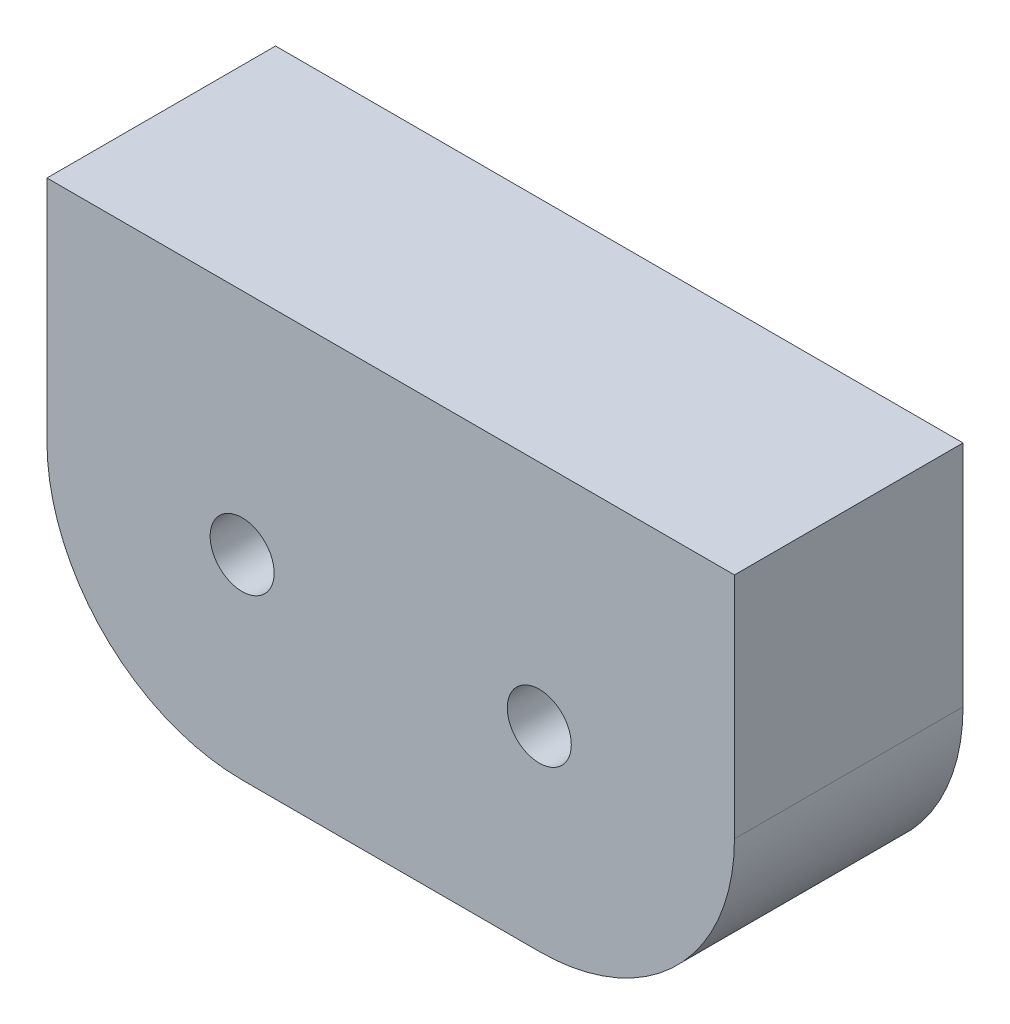
ISO-10303-21;
HEADER;
FILE_DESCRIPTION(('STEP AP214'),'2;1');
FILE_NAME('part.step','',(''),(''),'','','');
FILE_SCHEMA(('AUTOMOTIVE_DESIGN { 1 0 10303 214 1 1 1 1 }'));
ENDSEC;
DATA;
#1=APPLICATION_CONTEXT('core data for automotive mechanical design processes');
#2=APPLICATION_PROTOCOL_DEFINITION('international standard','automotive_design',2000,#1);
#3=PRODUCT_CONTEXT('',#1,'mechanical');
#4=PRODUCT('Part','Part','',(#3));
#5=PRODUCT_RELATED_PRODUCT_CATEGORY('part','',(#4));
#6=PRODUCT_DEFINITION_FORMATION('','',#4);
#7=PRODUCT_DEFINITION_CONTEXT('part definition',#1,'design');
#8=PRODUCT_DEFINITION('design','',#6,#7);
#9=PRODUCT_DEFINITION_SHAPE('','',#8);
#10=(LENGTH_UNIT() NAMED_UNIT(*) SI_UNIT(.MILLI.,.METRE.));
#11=(NAMED_UNIT(*) PLANE_ANGLE_UNIT() SI_UNIT($,.RADIAN.));
#12=(NAMED_UNIT(*) SI_UNIT($,.STERADIAN.) SOLID_ANGLE_UNIT());
#13=UNCERTAINTY_MEASURE_WITH_UNIT(LENGTH_MEASURE(1.E-05),#10,'distance_accuracy_value','');
#14=(GEOMETRIC_REPRESENTATION_CONTEXT(3) GLOBAL_UNCERTAINTY_ASSIGNED_CONTEXT((#13)) GLOBAL_UNIT_ASSIGNED_CONTEXT((#10,
#11,#12)) REPRESENTATION_CONTEXT('',''));
#15=CARTESIAN_POINT('',(0.,0.,0.));
#16=DIRECTION('',(0.,0.,1.));
#17=DIRECTION('',(1.,0.,0.));
#18=AXIS2_PLACEMENT_3D('',#15,#16,#17);
#19=CARTESIAN_POINT('',(-7.51917264782014,0.,5.));
#20=DIRECTION('',(1.,0.,0.));
#21=DIRECTION('',(0.,1.,0.));
#22=AXIS2_PLACEMENT_3D('',#19,#20,#21);
#23=PLANE('',#22);
#24=DIRECTION('',(0.,-1.,0.));
#25=VECTOR('',#24,1.);
#26=CARTESIAN_POINT('',(-7.51917264782014,0.,0.));
#27=LINE('',#26,#25);
#28=CARTESIAN_POINT('',(-7.51917264782014,3.25,0.));
#29=VERTEX_POINT('',#28);
#30=CARTESIAN_POINT('',(-7.51917264782014,-1.75,0.));
#31=VERTEX_POINT('',#30);
#32=EDGE_CURVE('E129',#29,#31,#27,.T.);
#33=ORIENTED_EDGE('',*,*,#32,.T.);
#34=DIRECTION('',(0.,0.,-1.));
#35=VECTOR('',#34,1.);
#36=CARTESIAN_POINT('',(-7.51917264782014,-1.75,5.));
#37=LINE('',#36,#35);
#38=CARTESIAN_POINT('',(-7.51917264782014,-1.75,5.));
#39=VERTEX_POINT('',#38);
#40=EDGE_CURVE('E11',#39,#31,#37,.T.);
#41=ORIENTED_EDGE('',*,*,#40,.F.);
#42=DIRECTION('',(0.,-1.,0.));
#43=VECTOR('',#42,1.);
#44=CARTESIAN_POINT('',(-7.51917264782014,0.,5.));
#45=LINE('',#44,#43);
#46=CARTESIAN_POINT('',(-7.51917264782014,3.25,5.));
#47=VERTEX_POINT('',#46);
#48=EDGE_CURVE('E154',#47,#39,#45,.T.);
#49=ORIENTED_EDGE('',*,*,#48,.F.);
#50=DIRECTION('',(0.,0.,-1.));
#51=VECTOR('',#50,1.);
#52=CARTESIAN_POINT('',(-7.51917264782014,3.25,5.));
#53=LINE('',#52,#51);
#54=EDGE_CURVE('E119',#47,#29,#53,.T.);
#55=ORIENTED_EDGE('',*,*,#54,.T.);
#56=EDGE_LOOP('',(#33,#41,#49,#55));
#57=FACE_BOUND('',#56,.T.);
#58=ADVANCED_FACE('F39',(#57),#23,.F.);
#59=CARTESIAN_POINT('',(-3.25,-1.75,5.));
#60=DIRECTION('',(0.,0.,-1.));
#61=DIRECTION('',(-1.,0.,0.));
#62=AXIS2_PLACEMENT_3D('',#59,#60,#61);
#63=CYLINDRICAL_SURFACE('',#62,4.26917264782014);
#64=CARTESIAN_POINT('',(-3.25,-1.75,0.));
#65=DIRECTION('',(0.,0.,1.));
#66=DIRECTION('',(1.,0.,0.));
#67=AXIS2_PLACEMENT_3D('',#64,#65,#66);
#68=CIRCLE('',#67,4.26917264782014);
#69=CARTESIAN_POINT('',(-3.25,-6.01917264782014,0.));
#70=VERTEX_POINT('',#69);
#71=EDGE_CURVE('E132',#31,#70,#68,.T.);
#72=ORIENTED_EDGE('',*,*,#71,.T.);
#73=DIRECTION('',(0.,0.,-1.));
#74=VECTOR('',#73,1.);
#75=CARTESIAN_POINT('',(-3.25,-6.01917264782014,5.));
#76=LINE('',#75,#74);
#77=CARTESIAN_POINT('',(-3.25,-6.01917264782014,5.));
#78=VERTEX_POINT('',#77);
#79=EDGE_CURVE('E48',#78,#70,#76,.T.);
#80=ORIENTED_EDGE('',*,*,#79,.F.);
#81=CARTESIAN_POINT('',(-3.25,-1.75,5.));
#82=DIRECTION('',(0.,0.,1.));
#83=DIRECTION('',(1.,0.,0.));
#84=AXIS2_PLACEMENT_3D('',#81,#82,#83);
#85=CIRCLE('',#84,4.26917264782014);
#86=EDGE_CURVE('E93',#39,#78,#85,.T.);
#87=ORIENTED_EDGE('',*,*,#86,.F.);
#88=ORIENTED_EDGE('',*,*,#40,.T.);
#89=EDGE_LOOP('',(#72,#80,#87,#88));
#90=FACE_BOUND('',#89,.T.);
#91=ADVANCED_FACE('F147',(#90),#63,.T.);
#92=CARTESIAN_POINT('',(0.,-6.01917264782014,5.));
#93=DIRECTION('',(0.,-1.,0.));
#94=DIRECTION('',(0.,0.,-1.));
#95=AXIS2_PLACEMENT_3D('',#92,#93,#94);
#96=PLANE('',#95);
#97=DIRECTION('',(-1.,0.,0.));
#98=VECTOR('',#97,1.);
#99=CARTESIAN_POINT('',(0.,-6.01917264782014,0.));
#100=LINE('',#99,#98);
#101=CARTESIAN_POINT('',(3.25,-6.01917264782014,0.));
#102=VERTEX_POINT('',#101);
#103=EDGE_CURVE('E135',#102,#70,#100,.T.);
#104=ORIENTED_EDGE('',*,*,#103,.F.);
#105=DIRECTION('',(0.,0.,-1.));
#106=VECTOR('',#105,1.);
#107=CARTESIAN_POINT('',(3.25,-6.01917264782014,5.));
#108=LINE('',#107,#106);
#109=CARTESIAN_POINT('',(3.25,-6.01917264782014,5.));
#110=VERTEX_POINT('',#109);
#111=EDGE_CURVE('E114',#110,#102,#108,.T.);
#112=ORIENTED_EDGE('',*,*,#111,.F.);
#113=DIRECTION('',(-1.,0.,0.));
#114=VECTOR('',#113,1.);
#115=CARTESIAN_POINT('',(0.,-6.01917264782014,5.));
#116=LINE('',#115,#114);
#117=EDGE_CURVE('E107',#110,#78,#116,.T.);
#118=ORIENTED_EDGE('',*,*,#117,.T.);
#119=ORIENTED_EDGE('',*,*,#79,.T.);
#120=EDGE_LOOP('',(#104,#112,#118,#119));
#121=FACE_BOUND('',#120,.T.);
#122=ADVANCED_FACE('F146',(#121),#96,.T.);
#123=CARTESIAN_POINT('',(3.25,-1.75,5.));
#124=DIRECTION('',(0.,0.,-1.));
#125=DIRECTION('',(-1.,0.,0.));
#126=AXIS2_PLACEMENT_3D('',#123,#124,#125);
#127=CYLINDRICAL_SURFACE('',#126,4.26917264782014);
#128=CARTESIAN_POINT('',(3.25,-1.75,0.));
#129=DIRECTION('',(0.,0.,1.));
#130=DIRECTION('',(1.,0.,0.));
#131=AXIS2_PLACEMENT_3D('',#128,#129,#130);
#132=CIRCLE('',#131,4.26917264782014);
#133=CARTESIAN_POINT('',(7.51917264782014,-1.75,0.));
#134=VERTEX_POINT('',#133);
#135=EDGE_CURVE('E113',#102,#134,#132,.T.);
#136=ORIENTED_EDGE('',*,*,#135,.T.);
#137=DIRECTION('',(0.,0.,-1.));
#138=VECTOR('',#137,1.);
#139=CARTESIAN_POINT('',(7.51917264782014,-1.75,5.));
#140=LINE('',#139,#138);
#141=CARTESIAN_POINT('',(7.51917264782014,-1.75,5.));
#142=VERTEX_POINT('',#141);
#143=EDGE_CURVE('E110',#142,#134,#140,.T.);
#144=ORIENTED_EDGE('',*,*,#143,.F.);
#145=CARTESIAN_POINT('',(3.25,-1.75,5.));
#146=DIRECTION('',(0.,0.,1.));
#147=DIRECTION('',(1.,0.,0.));
#148=AXIS2_PLACEMENT_3D('',#145,#146,#147);
#149=CIRCLE('',#148,4.26917264782014);
#150=EDGE_CURVE('E101',#110,#142,#149,.T.);
#151=ORIENTED_EDGE('',*,*,#150,.F.);
#152=ORIENTED_EDGE('',*,*,#111,.T.);
#153=EDGE_LOOP('',(#136,#144,#151,#152));
#154=FACE_BOUND('',#153,.T.);
#155=ADVANCED_FACE('F111',(#154),#127,.T.);
#156=CARTESIAN_POINT('',(7.51917264782014,0.,5.));
#157=DIRECTION('',(-1.,0.,0.));
#158=DIRECTION('',(0.,-1.,0.));
#159=AXIS2_PLACEMENT_3D('',#156,#157,#158);
#160=PLANE('',#159);
#161=DIRECTION('',(0.,1.,0.));
#162=VECTOR('',#161,1.);
#163=CARTESIAN_POINT('',(7.51917264782014,0.,0.));
#164=LINE('',#163,#162);
#165=CARTESIAN_POINT('',(7.51917264782015,3.25,0.));
#166=VERTEX_POINT('',#165);
#167=EDGE_CURVE('E79',#134,#166,#164,.T.);
#168=ORIENTED_EDGE('',*,*,#167,.T.);
#169=DIRECTION('',(0.,0.,-1.));
#170=VECTOR('',#169,1.);
#171=CARTESIAN_POINT('',(7.51917264782015,3.25,5.));
#172=LINE('',#171,#170);
#173=CARTESIAN_POINT('',(7.51917264782015,3.25,5.));
#174=VERTEX_POINT('',#173);
#175=EDGE_CURVE('E115',#174,#166,#172,.T.);
#176=ORIENTED_EDGE('',*,*,#175,.F.);
#177=DIRECTION('',(0.,1.,0.));
#178=VECTOR('',#177,1.);
#179=CARTESIAN_POINT('',(7.51917264782014,0.,5.));
#180=LINE('',#179,#178);
#181=EDGE_CURVE('E105',#142,#174,#180,.T.);
#182=ORIENTED_EDGE('',*,*,#181,.F.);
#183=ORIENTED_EDGE('',*,*,#143,.T.);
#184=EDGE_LOOP('',(#168,#176,#182,#183));
#185=FACE_BOUND('',#184,.T.);
#186=ADVANCED_FACE('F117',(#185),#160,.F.);
#187=CARTESIAN_POINT('',(-3.25,-1.75,5.));
#188=DIRECTION('',(0.,0.,-1.));
#189=DIRECTION('',(-1.,0.,0.));
#190=AXIS2_PLACEMENT_3D('',#187,#188,#189);
#191=CYLINDRICAL_SURFACE('',#190,0.7);
#192=CARTESIAN_POINT('',(-3.25,-1.75,5.));
#193=DIRECTION('',(0.,0.,1.));
#194=DIRECTION('',(1.,0.,0.));
#195=AXIS2_PLACEMENT_3D('',#192,#193,#194);
#196=CIRCLE('',#195,0.7);
#197=CARTESIAN_POINT('',(-2.55,-1.75,5.));
#198=VERTEX_POINT('',#197);
#199=EDGE_CURVE('E183',#198,#198,#196,.T.);
#200=ORIENTED_EDGE('',*,*,#199,.T.);
#201=EDGE_LOOP('',(#200));
#202=FACE_BOUND('',#201,.T.);
#203=CARTESIAN_POINT('',(-3.25,-1.75,0.));
#204=DIRECTION('',(0.,0.,1.));
#205=DIRECTION('',(1.,0.,0.));
#206=AXIS2_PLACEMENT_3D('',#203,#204,#205);
#207=CIRCLE('',#206,0.7);
#208=CARTESIAN_POINT('',(-2.55,-1.75,0.));
#209=VERTEX_POINT('',#208);
#210=EDGE_CURVE('E126',#209,#209,#207,.T.);
#211=ORIENTED_EDGE('',*,*,#210,.F.);
#212=EDGE_LOOP('',(#211));
#213=FACE_BOUND('',#212,.T.);
#214=ADVANCED_FACE('F164',(#202,#213),#191,.F.);
#215=CARTESIAN_POINT('',(3.25,-1.75,5.));
#216=DIRECTION('',(0.,0.,-1.));
#217=DIRECTION('',(-1.,0.,0.));
#218=AXIS2_PLACEMENT_3D('',#215,#216,#217);
#219=CYLINDRICAL_SURFACE('',#218,0.700000000000001);
#220=CARTESIAN_POINT('',(3.25,-1.75,5.));
#221=DIRECTION('',(0.,0.,1.));
#222=DIRECTION('',(1.,0.,0.));
#223=AXIS2_PLACEMENT_3D('',#220,#221,#222);
#224=CIRCLE('',#223,0.700000000000001);
#225=CARTESIAN_POINT('',(3.95,-1.75,5.));
#226=VERTEX_POINT('',#225);
#227=EDGE_CURVE('E141',#226,#226,#224,.T.);
#228=ORIENTED_EDGE('',*,*,#227,.T.);
#229=EDGE_LOOP('',(#228));
#230=FACE_BOUND('',#229,.T.);
#231=CARTESIAN_POINT('',(3.25,-1.75,0.));
#232=DIRECTION('',(0.,0.,1.));
#233=DIRECTION('',(1.,0.,0.));
#234=AXIS2_PLACEMENT_3D('',#231,#232,#233);
#235=CIRCLE('',#234,0.700000000000001);
#236=CARTESIAN_POINT('',(3.95,-1.75,0.));
#237=VERTEX_POINT('',#236);
#238=EDGE_CURVE('E123',#237,#237,#235,.T.);
#239=ORIENTED_EDGE('',*,*,#238,.F.);
#240=EDGE_LOOP('',(#239));
#241=FACE_BOUND('',#240,.T.);
#242=ADVANCED_FACE('F41',(#230,#241),#219,.F.);
#243=CARTESIAN_POINT('',(0.,3.25,5.));
#244=DIRECTION('',(0.,-1.,0.));
#245=DIRECTION('',(1.,0.,0.));
#246=AXIS2_PLACEMENT_3D('',#243,#244,#245);
#247=PLANE('',#246);
#248=DIRECTION('',(-1.,0.,0.));
#249=VECTOR('',#248,1.);
#250=CARTESIAN_POINT('',(0.,3.25,0.));
#251=LINE('',#250,#249);
#252=EDGE_CURVE('E85',#166,#29,#251,.T.);
#253=ORIENTED_EDGE('',*,*,#252,.T.);
#254=ORIENTED_EDGE('',*,*,#54,.F.);
#255=DIRECTION('',(-1.,0.,0.));
#256=VECTOR('',#255,1.);
#257=CARTESIAN_POINT('',(0.,3.25,5.));
#258=LINE('',#257,#256);
#259=EDGE_CURVE('E56',#174,#47,#258,.T.);
#260=ORIENTED_EDGE('',*,*,#259,.F.);
#261=ORIENTED_EDGE('',*,*,#175,.T.);
#262=EDGE_LOOP('',(#253,#254,#260,#261));
#263=FACE_BOUND('',#262,.T.);
#264=ADVANCED_FACE('F155',(#263),#247,.F.);
#265=CARTESIAN_POINT('',(0.,0.,5.));
#266=DIRECTION('',(0.,0.,1.));
#267=DIRECTION('',(1.,0.,0.));
#268=AXIS2_PLACEMENT_3D('',#265,#266,#267);
#269=PLANE('',#268);
#270=ORIENTED_EDGE('',*,*,#227,.F.);
#271=EDGE_LOOP('',(#270));
#272=FACE_BOUND('',#271,.T.);
#273=ORIENTED_EDGE('',*,*,#199,.F.);
#274=EDGE_LOOP('',(#273));
#275=FACE_BOUND('',#274,.T.);
#276=ORIENTED_EDGE('',*,*,#48,.T.);
#277=ORIENTED_EDGE('',*,*,#86,.T.);
#278=ORIENTED_EDGE('',*,*,#117,.F.);
#279=ORIENTED_EDGE('',*,*,#150,.T.);
#280=ORIENTED_EDGE('',*,*,#181,.T.);
#281=ORIENTED_EDGE('',*,*,#259,.T.);
#282=EDGE_LOOP('',(#276,#277,#278,#279,#280,#281));
#283=FACE_BOUND('',#282,.T.);
#284=ADVANCED_FACE('F103',(#272,#275,#283),#269,.T.);
#285=CARTESIAN_POINT('',(0.,0.,0.));
#286=DIRECTION('',(0.,0.,1.));
#287=DIRECTION('',(1.,0.,0.));
#288=AXIS2_PLACEMENT_3D('',#285,#286,#287);
#289=PLANE('',#288);
#290=ORIENTED_EDGE('',*,*,#238,.T.);
#291=EDGE_LOOP('',(#290));
#292=FACE_BOUND('',#291,.T.);
#293=ORIENTED_EDGE('',*,*,#210,.T.);
#294=EDGE_LOOP('',(#293));
#295=FACE_BOUND('',#294,.T.);
#296=ORIENTED_EDGE('',*,*,#32,.F.);
#297=ORIENTED_EDGE('',*,*,#252,.F.);
#298=ORIENTED_EDGE('',*,*,#167,.F.);
#299=ORIENTED_EDGE('',*,*,#135,.F.);
#300=ORIENTED_EDGE('',*,*,#103,.T.);
#301=ORIENTED_EDGE('',*,*,#71,.F.);
#302=EDGE_LOOP('',(#296,#297,#298,#299,#300,#301));
#303=FACE_BOUND('',#302,.T.);
#304=ADVANCED_FACE('F151',(#292,#295,#303),#289,.F.);
#305=CLOSED_SHELL('',(#58,#91,#122,#155,#186,#214,#242,#264,#284,#304));
#306=MANIFOLD_SOLID_BREP('B2',#305);
#307=ADVANCED_BREP_SHAPE_REPRESENTATION('',(#18,#306),#14);
#308=SHAPE_DEFINITION_REPRESENTATION(#9,#307);
ENDSEC;
END-ISO-10303-21;
